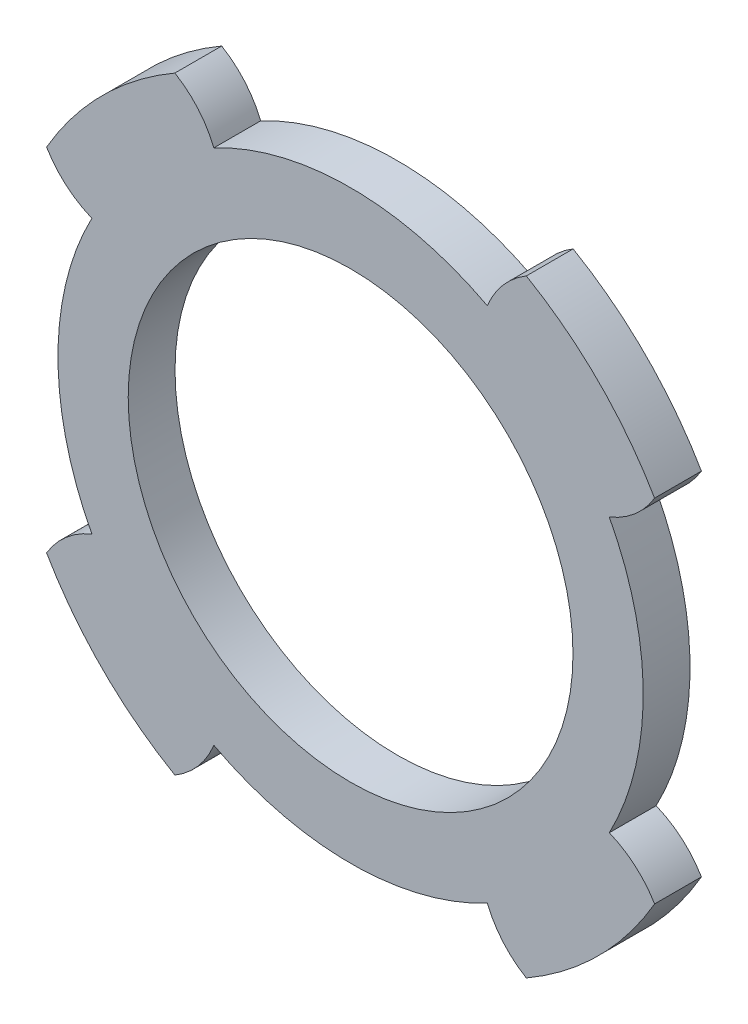
ISO-10303-21;
HEADER;
FILE_DESCRIPTION(('STEP AP214'),'2;1');
FILE_NAME('part.step','',(''),(''),'','','');
FILE_SCHEMA(('AUTOMOTIVE_DESIGN { 1 0 10303 214 1 1 1 1 }'));
ENDSEC;
DATA;
#1=APPLICATION_CONTEXT('core data for automotive mechanical design processes');
#2=APPLICATION_PROTOCOL_DEFINITION('international standard','automotive_design',2000,#1);
#3=PRODUCT_CONTEXT('',#1,'mechanical');
#4=PRODUCT('Part','Part','',(#3));
#5=PRODUCT_RELATED_PRODUCT_CATEGORY('part','',(#4));
#6=PRODUCT_DEFINITION_FORMATION('','',#4);
#7=PRODUCT_DEFINITION_CONTEXT('part definition',#1,'design');
#8=PRODUCT_DEFINITION('design','',#6,#7);
#9=PRODUCT_DEFINITION_SHAPE('','',#8);
#10=(LENGTH_UNIT() NAMED_UNIT(*) SI_UNIT(.MILLI.,.METRE.));
#11=(NAMED_UNIT(*) PLANE_ANGLE_UNIT() SI_UNIT($,.RADIAN.));
#12=(NAMED_UNIT(*) SI_UNIT($,.STERADIAN.) SOLID_ANGLE_UNIT());
#13=UNCERTAINTY_MEASURE_WITH_UNIT(LENGTH_MEASURE(1.E-05),#10,'distance_accuracy_value','');
#14=(GEOMETRIC_REPRESENTATION_CONTEXT(3) GLOBAL_UNCERTAINTY_ASSIGNED_CONTEXT((#13)) GLOBAL_UNIT_ASSIGNED_CONTEXT((#10,
#11,#12)) REPRESENTATION_CONTEXT('',''));
#15=CARTESIAN_POINT('',(0.,0.,0.));
#16=DIRECTION('',(0.,0.,1.));
#17=DIRECTION('',(1.,0.,0.));
#18=AXIS2_PLACEMENT_3D('',#15,#16,#17);
#19=CARTESIAN_POINT('',(9.54594154601839,9.54594154601839,4.));
#20=DIRECTION('',(0.,0.,1.));
#21=DIRECTION('',(1.,0.,0.));
#22=AXIS2_PLACEMENT_3D('',#19,#20,#21);
#23=CYLINDRICAL_SURFACE('',#22,4.);
#24=DIRECTION('',(0.,0.,-1.));
#25=VECTOR('',#24,1.);
#26=CARTESIAN_POINT('',(7.50620609596677,12.9867959884211,17.));
#27=LINE('',#26,#25);
#28=CARTESIAN_POINT('',(7.50620609596677,12.9867959884211,17.));
#29=VERTEX_POINT('',#28);
#30=CARTESIAN_POINT('',(7.50620609596677,12.9867959884211,15.));
#31=VERTEX_POINT('',#30);
#32=EDGE_CURVE('E224',#29,#31,#27,.T.);
#33=ORIENTED_EDGE('',*,*,#32,.T.);
#34=CARTESIAN_POINT('',(9.54594154601839,9.54594154601839,15.));
#35=DIRECTION('',(0.,0.,1.));
#36=DIRECTION('',(1.,0.,0.));
#37=AXIS2_PLACEMENT_3D('',#34,#35,#36);
#38=CIRCLE('',#37,4.);
#39=CARTESIAN_POINT('',(5.84021113093741,11.0517841974079,15.));
#40=VERTEX_POINT('',#39);
#41=EDGE_CURVE('E304',#31,#40,#38,.T.);
#42=ORIENTED_EDGE('',*,*,#41,.T.);
#43=DIRECTION('',(0.,0.,-1.));
#44=VECTOR('',#43,1.);
#45=CARTESIAN_POINT('',(5.84021113093741,11.0517841974079,17.));
#46=LINE('',#45,#44);
#47=CARTESIAN_POINT('',(5.84021113093741,11.0517841974079,17.));
#48=VERTEX_POINT('',#47);
#49=EDGE_CURVE('E218',#48,#40,#46,.T.);
#50=ORIENTED_EDGE('',*,*,#49,.F.);
#51=CARTESIAN_POINT('',(9.54594154601839,9.54594154601839,17.));
#52=DIRECTION('',(0.,0.,1.));
#53=DIRECTION('',(1.,0.,0.));
#54=AXIS2_PLACEMENT_3D('',#51,#52,#53);
#55=CIRCLE('',#54,4.);
#56=EDGE_CURVE('E226',#29,#48,#55,.T.);
#57=ORIENTED_EDGE('',*,*,#56,.F.);
#58=EDGE_LOOP('',(#33,#42,#50,#57));
#59=FACE_BOUND('',#58,.T.);
#60=ADVANCED_FACE('F90',(#59),#23,.T.);
#61=CARTESIAN_POINT('',(-9.54594154601839,9.54594154601839,17.));
#62=DIRECTION('',(0.,0.,-1.));
#63=DIRECTION('',(-1.,0.,0.));
#64=AXIS2_PLACEMENT_3D('',#61,#62,#63);
#65=CYLINDRICAL_SURFACE('',#64,4.);
#66=DIRECTION('',(0.,0.,-1.));
#67=VECTOR('',#66,1.);
#68=CARTESIAN_POINT('',(-5.84021113093741,11.0517841974079,17.));
#69=LINE('',#68,#67);
#70=CARTESIAN_POINT('',(-5.84021113093741,11.0517841974079,17.));
#71=VERTEX_POINT('',#70);
#72=CARTESIAN_POINT('',(-5.84021113093742,11.0517841974079,15.));
#73=VERTEX_POINT('',#72);
#74=EDGE_CURVE('E215',#71,#73,#69,.T.);
#75=ORIENTED_EDGE('',*,*,#74,.T.);
#76=CARTESIAN_POINT('',(-9.54594154601839,9.54594154601839,15.));
#77=DIRECTION('',(0.,0.,1.));
#78=DIRECTION('',(1.,0.,0.));
#79=AXIS2_PLACEMENT_3D('',#76,#77,#78);
#80=CIRCLE('',#79,4.);
#81=CARTESIAN_POINT('',(-7.50620609596677,12.9867959884211,15.));
#82=VERTEX_POINT('',#81);
#83=EDGE_CURVE('E199',#73,#82,#80,.T.);
#84=ORIENTED_EDGE('',*,*,#83,.T.);
#85=DIRECTION('',(0.,0.,-1.));
#86=VECTOR('',#85,1.);
#87=CARTESIAN_POINT('',(-7.50620609596677,12.9867959884211,17.));
#88=LINE('',#87,#86);
#89=CARTESIAN_POINT('',(-7.50620609596677,12.9867959884211,17.));
#90=VERTEX_POINT('',#89);
#91=EDGE_CURVE('E12',#90,#82,#88,.T.);
#92=ORIENTED_EDGE('',*,*,#91,.F.);
#93=CARTESIAN_POINT('',(-9.54594154601839,9.54594154601839,17.));
#94=DIRECTION('',(0.,0.,1.));
#95=DIRECTION('',(1.,0.,0.));
#96=AXIS2_PLACEMENT_3D('',#93,#94,#95);
#97=CIRCLE('',#96,4.);
#98=EDGE_CURVE('E219',#71,#90,#97,.T.);
#99=ORIENTED_EDGE('',*,*,#98,.F.);
#100=EDGE_LOOP('',(#75,#84,#92,#99));
#101=FACE_BOUND('',#100,.T.);
#102=ADVANCED_FACE('F222',(#101),#65,.T.);
#103=CARTESIAN_POINT('',(-9.54594154601839,-9.54594154601839,17.));
#104=DIRECTION('',(0.,0.,-1.));
#105=DIRECTION('',(-1.,0.,0.));
#106=AXIS2_PLACEMENT_3D('',#103,#104,#105);
#107=CYLINDRICAL_SURFACE('',#106,4.);
#108=DIRECTION('',(0.,0.,-1.));
#109=VECTOR('',#108,1.);
#110=CARTESIAN_POINT('',(-11.0517841974079,-5.84021113093741,17.));
#111=LINE('',#110,#109);
#112=CARTESIAN_POINT('',(-11.0517841974079,-5.84021113093741,17.));
#113=VERTEX_POINT('',#112);
#114=CARTESIAN_POINT('',(-11.0517841974079,-5.84021113093741,15.));
#115=VERTEX_POINT('',#114);
#116=EDGE_CURVE('E259',#113,#115,#111,.T.);
#117=ORIENTED_EDGE('',*,*,#116,.T.);
#118=CARTESIAN_POINT('',(-9.54594154601839,-9.54594154601839,15.));
#119=DIRECTION('',(0.,0.,1.));
#120=DIRECTION('',(1.,0.,0.));
#121=AXIS2_PLACEMENT_3D('',#118,#119,#120);
#122=CIRCLE('',#121,4.);
#123=CARTESIAN_POINT('',(-12.9867959884211,-7.50620609596677,15.));
#124=VERTEX_POINT('',#123);
#125=EDGE_CURVE('E337',#115,#124,#122,.T.);
#126=ORIENTED_EDGE('',*,*,#125,.T.);
#127=DIRECTION('',(0.,0.,-1.));
#128=VECTOR('',#127,1.);
#129=CARTESIAN_POINT('',(-12.9867959884211,-7.50620609596677,17.));
#130=LINE('',#129,#128);
#131=CARTESIAN_POINT('',(-12.9867959884211,-7.50620609596677,17.));
#132=VERTEX_POINT('',#131);
#133=EDGE_CURVE('E256',#132,#124,#130,.T.);
#134=ORIENTED_EDGE('',*,*,#133,.F.);
#135=CARTESIAN_POINT('',(-9.54594154601839,-9.54594154601839,17.));
#136=DIRECTION('',(0.,0.,1.));
#137=DIRECTION('',(1.,0.,0.));
#138=AXIS2_PLACEMENT_3D('',#135,#136,#137);
#139=CIRCLE('',#138,4.);
#140=EDGE_CURVE('E324',#113,#132,#139,.T.);
#141=ORIENTED_EDGE('',*,*,#140,.F.);
#142=EDGE_LOOP('',(#117,#126,#134,#141));
#143=FACE_BOUND('',#142,.T.);
#144=ADVANCED_FACE('F343',(#143),#107,.T.);
#145=CARTESIAN_POINT('',(9.54594154601839,-9.54594154601839,17.));
#146=DIRECTION('',(0.,0.,-1.));
#147=DIRECTION('',(-1.,0.,0.));
#148=AXIS2_PLACEMENT_3D('',#145,#146,#147);
#149=CYLINDRICAL_SURFACE('',#148,4.);
#150=DIRECTION('',(0.,0.,-1.));
#151=VECTOR('',#150,1.);
#152=CARTESIAN_POINT('',(12.9867959884211,-7.50620609596677,17.));
#153=LINE('',#152,#151);
#154=CARTESIAN_POINT('',(12.9867959884211,-7.50620609596677,17.));
#155=VERTEX_POINT('',#154);
#156=CARTESIAN_POINT('',(12.9867959884211,-7.50620609596677,15.));
#157=VERTEX_POINT('',#156);
#158=EDGE_CURVE('E241',#155,#157,#153,.T.);
#159=ORIENTED_EDGE('',*,*,#158,.T.);
#160=CARTESIAN_POINT('',(9.54594154601839,-9.54594154601839,15.));
#161=DIRECTION('',(0.,0.,1.));
#162=DIRECTION('',(1.,0.,0.));
#163=AXIS2_PLACEMENT_3D('',#160,#161,#162);
#164=CIRCLE('',#163,4.);
#165=CARTESIAN_POINT('',(11.0517841974079,-5.84021113093741,15.));
#166=VERTEX_POINT('',#165);
#167=EDGE_CURVE('E332',#157,#166,#164,.T.);
#168=ORIENTED_EDGE('',*,*,#167,.T.);
#169=DIRECTION('',(0.,0.,-1.));
#170=VECTOR('',#169,1.);
#171=CARTESIAN_POINT('',(11.0517841974079,-5.84021113093741,17.));
#172=LINE('',#171,#170);
#173=CARTESIAN_POINT('',(11.0517841974079,-5.84021113093741,17.));
#174=VERTEX_POINT('',#173);
#175=EDGE_CURVE('E238',#174,#166,#172,.T.);
#176=ORIENTED_EDGE('',*,*,#175,.F.);
#177=CARTESIAN_POINT('',(9.54594154601839,-9.54594154601839,17.));
#178=DIRECTION('',(0.,0.,1.));
#179=DIRECTION('',(1.,0.,0.));
#180=AXIS2_PLACEMENT_3D('',#177,#178,#179);
#181=CIRCLE('',#180,4.);
#182=EDGE_CURVE('E312',#155,#174,#181,.T.);
#183=ORIENTED_EDGE('',*,*,#182,.F.);
#184=EDGE_LOOP('',(#159,#168,#176,#183));
#185=FACE_BOUND('',#184,.T.);
#186=ADVANCED_FACE('F374',(#185),#149,.T.);
#187=DIRECTION('',(0.,0.,-1.));
#188=VECTOR('',#187,1.);
#189=CARTESIAN_POINT('',(11.0517841974079,5.84021113093741,17.));
#190=LINE('',#189,#188);
#191=CARTESIAN_POINT('',(11.0517841974079,5.84021113093741,17.));
#192=VERTEX_POINT('',#191);
#193=CARTESIAN_POINT('',(11.0517841974079,5.84021113093741,15.));
#194=VERTEX_POINT('',#193);
#195=EDGE_CURVE('E235',#192,#194,#190,.T.);
#196=ORIENTED_EDGE('',*,*,#195,.T.);
#197=CARTESIAN_POINT('',(12.9867959884211,7.50620609596677,15.));
#198=VERTEX_POINT('',#197);
#199=EDGE_CURVE('E336',#194,#198,#38,.T.);
#200=ORIENTED_EDGE('',*,*,#199,.T.);
#201=DIRECTION('',(0.,0.,-1.));
#202=VECTOR('',#201,1.);
#203=CARTESIAN_POINT('',(12.9867959884211,7.50620609596677,17.));
#204=LINE('',#203,#202);
#205=CARTESIAN_POINT('',(12.9867959884211,7.50620609596677,17.));
#206=VERTEX_POINT('',#205);
#207=EDGE_CURVE('E232',#206,#198,#204,.T.);
#208=ORIENTED_EDGE('',*,*,#207,.F.);
#209=CARTESIAN_POINT('',(9.54594154601839,9.54594154601839,17.));
#210=DIRECTION('',(0.,0.,1.));
#211=DIRECTION('',(1.,0.,0.));
#212=AXIS2_PLACEMENT_3D('',#209,#210,#211);
#213=CIRCLE('',#212,4.);
#214=EDGE_CURVE('E306',#192,#206,#213,.T.);
#215=ORIENTED_EDGE('',*,*,#214,.F.);
#216=EDGE_LOOP('',(#196,#200,#208,#215));
#217=FACE_BOUND('',#216,.T.);
#218=ADVANCED_FACE('F92',(#217),#23,.T.);
#219=CARTESIAN_POINT('',(-4.7729707730092,4.7729707730092,15.));
#220=DIRECTION('',(0.,0.,1.));
#221=DIRECTION('',(1.,0.,0.));
#222=AXIS2_PLACEMENT_3D('',#219,#220,#221);
#223=PLANE('',#222);
#224=CARTESIAN_POINT('',(0.,0.,15.));
#225=DIRECTION('',(0.,0.,1.));
#226=DIRECTION('',(1.,0.,0.));
#227=AXIS2_PLACEMENT_3D('',#224,#225,#226);
#228=CIRCLE('',#227,12.5);
#229=EDGE_CURVE('E204',#40,#73,#228,.T.);
#230=ORIENTED_EDGE('',*,*,#229,.F.);
#231=ORIENTED_EDGE('',*,*,#41,.F.);
#232=CARTESIAN_POINT('',(0.,0.,15.));
#233=DIRECTION('',(0.,0.,1.));
#234=DIRECTION('',(1.,0.,0.));
#235=AXIS2_PLACEMENT_3D('',#232,#233,#234);
#236=CIRCLE('',#235,15.);
#237=EDGE_CURVE('E220',#198,#31,#236,.T.);
#238=ORIENTED_EDGE('',*,*,#237,.F.);
#239=ORIENTED_EDGE('',*,*,#199,.F.);
#240=CARTESIAN_POINT('',(0.,0.,15.));
#241=DIRECTION('',(0.,0.,1.));
#242=DIRECTION('',(1.,0.,0.));
#243=AXIS2_PLACEMENT_3D('',#240,#241,#242);
#244=CIRCLE('',#243,12.5);
#245=EDGE_CURVE('E293',#166,#194,#244,.T.);
#246=ORIENTED_EDGE('',*,*,#245,.F.);
#247=ORIENTED_EDGE('',*,*,#167,.F.);
#248=CARTESIAN_POINT('',(0.,0.,15.));
#249=DIRECTION('',(0.,0.,1.));
#250=DIRECTION('',(1.,0.,0.));
#251=AXIS2_PLACEMENT_3D('',#248,#249,#250);
#252=CIRCLE('',#251,15.);
#253=CARTESIAN_POINT('',(7.50620609596677,-12.9867959884211,15.));
#254=VERTEX_POINT('',#253);
#255=EDGE_CURVE('E290',#254,#157,#252,.T.);
#256=ORIENTED_EDGE('',*,*,#255,.F.);
#257=CARTESIAN_POINT('',(5.84021113093741,-11.0517841974079,15.));
#258=VERTEX_POINT('',#257);
#259=EDGE_CURVE('E339',#258,#254,#164,.T.);
#260=ORIENTED_EDGE('',*,*,#259,.F.);
#261=CARTESIAN_POINT('',(0.,0.,15.));
#262=DIRECTION('',(0.,0.,1.));
#263=DIRECTION('',(1.,0.,0.));
#264=AXIS2_PLACEMENT_3D('',#261,#262,#263);
#265=CIRCLE('',#264,12.5);
#266=CARTESIAN_POINT('',(-5.84021113093741,-11.0517841974079,15.));
#267=VERTEX_POINT('',#266);
#268=EDGE_CURVE('E287',#267,#258,#265,.T.);
#269=ORIENTED_EDGE('',*,*,#268,.F.);
#270=CARTESIAN_POINT('',(-7.50620609596678,-12.9867959884211,15.));
#271=VERTEX_POINT('',#270);
#272=EDGE_CURVE('E334',#271,#267,#122,.T.);
#273=ORIENTED_EDGE('',*,*,#272,.F.);
#274=CARTESIAN_POINT('',(0.,0.,15.));
#275=DIRECTION('',(0.,0.,1.));
#276=DIRECTION('',(1.,0.,0.));
#277=AXIS2_PLACEMENT_3D('',#274,#275,#276);
#278=CIRCLE('',#277,15.);
#279=EDGE_CURVE('E278',#124,#271,#278,.T.);
#280=ORIENTED_EDGE('',*,*,#279,.F.);
#281=ORIENTED_EDGE('',*,*,#125,.F.);
#282=CARTESIAN_POINT('',(0.,0.,15.));
#283=DIRECTION('',(0.,0.,1.));
#284=DIRECTION('',(1.,0.,0.));
#285=AXIS2_PLACEMENT_3D('',#282,#283,#284);
#286=CIRCLE('',#285,12.5);
#287=CARTESIAN_POINT('',(-11.0517841974079,5.84021113093741,15.));
#288=VERTEX_POINT('',#287);
#289=EDGE_CURVE('E274',#288,#115,#286,.T.);
#290=ORIENTED_EDGE('',*,*,#289,.F.);
#291=CARTESIAN_POINT('',(-12.9867959884211,7.50620609596676,15.));
#292=VERTEX_POINT('',#291);
#293=EDGE_CURVE('E210',#292,#288,#80,.T.);
#294=ORIENTED_EDGE('',*,*,#293,.F.);
#295=CARTESIAN_POINT('',(0.,0.,15.));
#296=DIRECTION('',(0.,0.,1.));
#297=DIRECTION('',(1.,0.,0.));
#298=AXIS2_PLACEMENT_3D('',#295,#296,#297);
#299=CIRCLE('',#298,15.);
#300=EDGE_CURVE('E206',#82,#292,#299,.T.);
#301=ORIENTED_EDGE('',*,*,#300,.F.);
#302=ORIENTED_EDGE('',*,*,#83,.F.);
#303=EDGE_LOOP('',(#230,#231,#238,#239,#246,#247,#256,#260,#269,#273,#280,#281,#290,#294,#301,#302));
#304=FACE_BOUND('',#303,.T.);
#305=CARTESIAN_POINT('',(0.,0.,15.));
#306=DIRECTION('',(0.,0.,1.));
#307=DIRECTION('',(1.,0.,0.));
#308=AXIS2_PLACEMENT_3D('',#305,#306,#307);
#309=CIRCLE('',#308,9.5);
#310=CARTESIAN_POINT('',(9.5,0.,15.));
#311=VERTEX_POINT('',#310);
#312=EDGE_CURVE('E281',#311,#311,#309,.T.);
#313=ORIENTED_EDGE('',*,*,#312,.T.);
#314=EDGE_LOOP('',(#313));
#315=FACE_BOUND('',#314,.T.);
#316=ADVANCED_FACE('F201',(#304,#315),#223,.F.);
#317=CARTESIAN_POINT('',(-4.7729707730092,4.7729707730092,17.));
#318=DIRECTION('',(0.,0.,1.));
#319=DIRECTION('',(1.,0.,0.));
#320=AXIS2_PLACEMENT_3D('',#317,#318,#319);
#321=PLANE('',#320);
#322=ORIENTED_EDGE('',*,*,#98,.T.);
#323=CARTESIAN_POINT('',(0.,0.,17.));
#324=DIRECTION('',(0.,0.,1.));
#325=DIRECTION('',(1.,0.,0.));
#326=AXIS2_PLACEMENT_3D('',#323,#324,#325);
#327=CIRCLE('',#326,15.);
#328=CARTESIAN_POINT('',(-12.9867959884211,7.50620609596676,17.));
#329=VERTEX_POINT('',#328);
#330=EDGE_CURVE('E273',#90,#329,#327,.T.);
#331=ORIENTED_EDGE('',*,*,#330,.T.);
#332=CARTESIAN_POINT('',(-9.54594154601839,9.54594154601839,17.));
#333=DIRECTION('',(0.,0.,1.));
#334=DIRECTION('',(1.,0.,0.));
#335=AXIS2_PLACEMENT_3D('',#332,#333,#334);
#336=CIRCLE('',#335,4.);
#337=CARTESIAN_POINT('',(-11.0517841974079,5.84021113093741,17.));
#338=VERTEX_POINT('',#337);
#339=EDGE_CURVE('E270',#329,#338,#336,.T.);
#340=ORIENTED_EDGE('',*,*,#339,.T.);
#341=CARTESIAN_POINT('',(0.,0.,17.));
#342=DIRECTION('',(0.,0.,1.));
#343=DIRECTION('',(1.,0.,0.));
#344=AXIS2_PLACEMENT_3D('',#341,#342,#343);
#345=CIRCLE('',#344,12.5);
#346=EDGE_CURVE('E326',#338,#113,#345,.T.);
#347=ORIENTED_EDGE('',*,*,#346,.T.);
#348=ORIENTED_EDGE('',*,*,#140,.T.);
#349=CARTESIAN_POINT('',(0.,0.,17.));
#350=DIRECTION('',(0.,0.,1.));
#351=DIRECTION('',(1.,0.,0.));
#352=AXIS2_PLACEMENT_3D('',#349,#350,#351);
#353=CIRCLE('',#352,15.);
#354=CARTESIAN_POINT('',(-7.50620609596678,-12.9867959884211,17.));
#355=VERTEX_POINT('',#354);
#356=EDGE_CURVE('E322',#132,#355,#353,.T.);
#357=ORIENTED_EDGE('',*,*,#356,.T.);
#358=CARTESIAN_POINT('',(-9.54594154601839,-9.54594154601839,17.));
#359=DIRECTION('',(0.,0.,1.));
#360=DIRECTION('',(1.,0.,0.));
#361=AXIS2_PLACEMENT_3D('',#358,#359,#360);
#362=CIRCLE('',#361,4.);
#363=CARTESIAN_POINT('',(-5.84021113093741,-11.0517841974079,17.));
#364=VERTEX_POINT('',#363);
#365=EDGE_CURVE('E320',#355,#364,#362,.T.);
#366=ORIENTED_EDGE('',*,*,#365,.T.);
#367=CARTESIAN_POINT('',(0.,0.,17.));
#368=DIRECTION('',(0.,0.,1.));
#369=DIRECTION('',(1.,0.,0.));
#370=AXIS2_PLACEMENT_3D('',#367,#368,#369);
#371=CIRCLE('',#370,12.5);
#372=CARTESIAN_POINT('',(5.84021113093741,-11.0517841974079,17.));
#373=VERTEX_POINT('',#372);
#374=EDGE_CURVE('E318',#364,#373,#371,.T.);
#375=ORIENTED_EDGE('',*,*,#374,.T.);
#376=CARTESIAN_POINT('',(9.54594154601839,-9.54594154601839,17.));
#377=DIRECTION('',(0.,0.,1.));
#378=DIRECTION('',(1.,0.,0.));
#379=AXIS2_PLACEMENT_3D('',#376,#377,#378);
#380=CIRCLE('',#379,4.);
#381=CARTESIAN_POINT('',(7.50620609596677,-12.9867959884211,17.));
#382=VERTEX_POINT('',#381);
#383=EDGE_CURVE('E316',#373,#382,#380,.T.);
#384=ORIENTED_EDGE('',*,*,#383,.T.);
#385=CARTESIAN_POINT('',(0.,0.,17.));
#386=DIRECTION('',(0.,0.,1.));
#387=DIRECTION('',(1.,0.,0.));
#388=AXIS2_PLACEMENT_3D('',#385,#386,#387);
#389=CIRCLE('',#388,15.);
#390=EDGE_CURVE('E314',#382,#155,#389,.T.);
#391=ORIENTED_EDGE('',*,*,#390,.T.);
#392=ORIENTED_EDGE('',*,*,#182,.T.);
#393=CARTESIAN_POINT('',(0.,0.,17.));
#394=DIRECTION('',(0.,0.,1.));
#395=DIRECTION('',(1.,0.,0.));
#396=AXIS2_PLACEMENT_3D('',#393,#394,#395);
#397=CIRCLE('',#396,12.5);
#398=EDGE_CURVE('E310',#174,#192,#397,.T.);
#399=ORIENTED_EDGE('',*,*,#398,.T.);
#400=ORIENTED_EDGE('',*,*,#214,.T.);
#401=CARTESIAN_POINT('',(0.,0.,17.));
#402=DIRECTION('',(0.,0.,1.));
#403=DIRECTION('',(1.,0.,0.));
#404=AXIS2_PLACEMENT_3D('',#401,#402,#403);
#405=CIRCLE('',#404,15.);
#406=EDGE_CURVE('E305',#206,#29,#405,.T.);
#407=ORIENTED_EDGE('',*,*,#406,.T.);
#408=ORIENTED_EDGE('',*,*,#56,.T.);
#409=CARTESIAN_POINT('',(0.,0.,17.));
#410=DIRECTION('',(0.,0.,1.));
#411=DIRECTION('',(1.,0.,0.));
#412=AXIS2_PLACEMENT_3D('',#409,#410,#411);
#413=CIRCLE('',#412,12.5);
#414=EDGE_CURVE('E106',#48,#71,#413,.T.);
#415=ORIENTED_EDGE('',*,*,#414,.T.);
#416=EDGE_LOOP('',(#322,#331,#340,#347,#348,#357,#366,#375,#384,#391,#392,#399,#400,#407,#408,#415));
#417=FACE_BOUND('',#416,.T.);
#418=CARTESIAN_POINT('',(0.,0.,17.));
#419=DIRECTION('',(0.,0.,1.));
#420=DIRECTION('',(1.,0.,0.));
#421=AXIS2_PLACEMENT_3D('',#418,#419,#420);
#422=CIRCLE('',#421,9.5);
#423=CARTESIAN_POINT('',(9.5,0.,17.));
#424=VERTEX_POINT('',#423);
#425=EDGE_CURVE('E275',#424,#424,#422,.T.);
#426=ORIENTED_EDGE('',*,*,#425,.F.);
#427=EDGE_LOOP('',(#426));
#428=FACE_BOUND('',#427,.T.);
#429=ADVANCED_FACE('F352',(#417,#428),#321,.T.);
#430=DIRECTION('',(0.,0.,-1.));
#431=VECTOR('',#430,1.);
#432=CARTESIAN_POINT('',(-12.9867959884211,7.50620609596676,17.));
#433=LINE('',#432,#431);
#434=EDGE_CURVE('E99',#329,#292,#433,.T.);
#435=ORIENTED_EDGE('',*,*,#434,.T.);
#436=ORIENTED_EDGE('',*,*,#293,.T.);
#437=DIRECTION('',(0.,0.,-1.));
#438=VECTOR('',#437,1.);
#439=CARTESIAN_POINT('',(-11.0517841974079,5.84021113093741,17.));
#440=LINE('',#439,#438);
#441=EDGE_CURVE('E262',#338,#288,#440,.T.);
#442=ORIENTED_EDGE('',*,*,#441,.F.);
#443=ORIENTED_EDGE('',*,*,#339,.F.);
#444=EDGE_LOOP('',(#435,#436,#442,#443));
#445=FACE_BOUND('',#444,.T.);
#446=ADVANCED_FACE('F268',(#445),#65,.T.);
#447=CARTESIAN_POINT('',(0.,0.,17.));
#448=DIRECTION('',(0.,0.,-1.));
#449=DIRECTION('',(-1.,0.,0.));
#450=AXIS2_PLACEMENT_3D('',#447,#448,#449);
#451=CYLINDRICAL_SURFACE('',#450,15.);
#452=ORIENTED_EDGE('',*,*,#300,.T.);
#453=ORIENTED_EDGE('',*,*,#434,.F.);
#454=ORIENTED_EDGE('',*,*,#330,.F.);
#455=ORIENTED_EDGE('',*,*,#91,.T.);
#456=EDGE_LOOP('',(#452,#453,#454,#455));
#457=FACE_BOUND('',#456,.T.);
#458=ADVANCED_FACE('F272',(#457),#451,.T.);
#459=CARTESIAN_POINT('',(0.,0.,17.));
#460=DIRECTION('',(0.,0.,-1.));
#461=DIRECTION('',(-1.,0.,0.));
#462=AXIS2_PLACEMENT_3D('',#459,#460,#461);
#463=CYLINDRICAL_SURFACE('',#462,12.5);
#464=ORIENTED_EDGE('',*,*,#289,.T.);
#465=ORIENTED_EDGE('',*,*,#116,.F.);
#466=ORIENTED_EDGE('',*,*,#346,.F.);
#467=ORIENTED_EDGE('',*,*,#441,.T.);
#468=EDGE_LOOP('',(#464,#465,#466,#467));
#469=FACE_BOUND('',#468,.T.);
#470=ADVANCED_FACE('F357',(#469),#463,.T.);
#471=DIRECTION('',(0.,0.,-1.));
#472=VECTOR('',#471,1.);
#473=CARTESIAN_POINT('',(-7.50620609596678,-12.9867959884211,17.));
#474=LINE('',#473,#472);
#475=EDGE_CURVE('E253',#355,#271,#474,.T.);
#476=ORIENTED_EDGE('',*,*,#475,.T.);
#477=ORIENTED_EDGE('',*,*,#272,.T.);
#478=DIRECTION('',(0.,0.,-1.));
#479=VECTOR('',#478,1.);
#480=CARTESIAN_POINT('',(-5.84021113093741,-11.0517841974079,17.));
#481=LINE('',#480,#479);
#482=EDGE_CURVE('E250',#364,#267,#481,.T.);
#483=ORIENTED_EDGE('',*,*,#482,.F.);
#484=ORIENTED_EDGE('',*,*,#365,.F.);
#485=EDGE_LOOP('',(#476,#477,#483,#484));
#486=FACE_BOUND('',#485,.T.);
#487=ADVANCED_FACE('F359',(#486),#107,.T.);
#488=CARTESIAN_POINT('',(0.,0.,17.));
#489=DIRECTION('',(0.,0.,-1.));
#490=DIRECTION('',(-1.,0.,0.));
#491=AXIS2_PLACEMENT_3D('',#488,#489,#490);
#492=CYLINDRICAL_SURFACE('',#491,15.);
#493=ORIENTED_EDGE('',*,*,#279,.T.);
#494=ORIENTED_EDGE('',*,*,#475,.F.);
#495=ORIENTED_EDGE('',*,*,#356,.F.);
#496=ORIENTED_EDGE('',*,*,#133,.T.);
#497=EDGE_LOOP('',(#493,#494,#495,#496));
#498=FACE_BOUND('',#497,.T.);
#499=ADVANCED_FACE('F349',(#498),#492,.T.);
#500=CARTESIAN_POINT('',(0.,0.,17.));
#501=DIRECTION('',(0.,0.,-1.));
#502=DIRECTION('',(-1.,0.,0.));
#503=AXIS2_PLACEMENT_3D('',#500,#501,#502);
#504=CYLINDRICAL_SURFACE('',#503,12.5);
#505=ORIENTED_EDGE('',*,*,#268,.T.);
#506=DIRECTION('',(0.,0.,-1.));
#507=VECTOR('',#506,1.);
#508=CARTESIAN_POINT('',(5.84021113093741,-11.0517841974079,17.));
#509=LINE('',#508,#507);
#510=EDGE_CURVE('E247',#373,#258,#509,.T.);
#511=ORIENTED_EDGE('',*,*,#510,.F.);
#512=ORIENTED_EDGE('',*,*,#374,.F.);
#513=ORIENTED_EDGE('',*,*,#482,.T.);
#514=EDGE_LOOP('',(#505,#511,#512,#513));
#515=FACE_BOUND('',#514,.T.);
#516=ADVANCED_FACE('F404',(#515),#504,.T.);
#517=ORIENTED_EDGE('',*,*,#510,.T.);
#518=ORIENTED_EDGE('',*,*,#259,.T.);
#519=DIRECTION('',(0.,0.,-1.));
#520=VECTOR('',#519,1.);
#521=CARTESIAN_POINT('',(7.50620609596677,-12.9867959884211,17.));
#522=LINE('',#521,#520);
#523=EDGE_CURVE('E244',#382,#254,#522,.T.);
#524=ORIENTED_EDGE('',*,*,#523,.F.);
#525=ORIENTED_EDGE('',*,*,#383,.F.);
#526=EDGE_LOOP('',(#517,#518,#524,#525));
#527=FACE_BOUND('',#526,.T.);
#528=ADVANCED_FACE('F383',(#527),#149,.T.);
#529=CARTESIAN_POINT('',(0.,0.,17.));
#530=DIRECTION('',(0.,0.,-1.));
#531=DIRECTION('',(-1.,0.,0.));
#532=AXIS2_PLACEMENT_3D('',#529,#530,#531);
#533=CYLINDRICAL_SURFACE('',#532,15.);
#534=ORIENTED_EDGE('',*,*,#255,.T.);
#535=ORIENTED_EDGE('',*,*,#158,.F.);
#536=ORIENTED_EDGE('',*,*,#390,.F.);
#537=ORIENTED_EDGE('',*,*,#523,.T.);
#538=EDGE_LOOP('',(#534,#535,#536,#537));
#539=FACE_BOUND('',#538,.T.);
#540=ADVANCED_FACE('F394',(#539),#533,.T.);
#541=CARTESIAN_POINT('',(0.,0.,17.));
#542=DIRECTION('',(0.,0.,-1.));
#543=DIRECTION('',(-1.,0.,0.));
#544=AXIS2_PLACEMENT_3D('',#541,#542,#543);
#545=CYLINDRICAL_SURFACE('',#544,12.5);
#546=ORIENTED_EDGE('',*,*,#245,.T.);
#547=ORIENTED_EDGE('',*,*,#195,.F.);
#548=ORIENTED_EDGE('',*,*,#398,.F.);
#549=ORIENTED_EDGE('',*,*,#175,.T.);
#550=EDGE_LOOP('',(#546,#547,#548,#549));
#551=FACE_BOUND('',#550,.T.);
#552=ADVANCED_FACE('F388',(#551),#545,.T.);
#553=CARTESIAN_POINT('',(0.,0.,17.));
#554=DIRECTION('',(0.,0.,-1.));
#555=DIRECTION('',(-1.,0.,0.));
#556=AXIS2_PLACEMENT_3D('',#553,#554,#555);
#557=CYLINDRICAL_SURFACE('',#556,15.);
#558=ORIENTED_EDGE('',*,*,#237,.T.);
#559=ORIENTED_EDGE('',*,*,#32,.F.);
#560=ORIENTED_EDGE('',*,*,#406,.F.);
#561=ORIENTED_EDGE('',*,*,#207,.T.);
#562=EDGE_LOOP('',(#558,#559,#560,#561));
#563=FACE_BOUND('',#562,.T.);
#564=ADVANCED_FACE('F298',(#563),#557,.T.);
#565=CARTESIAN_POINT('',(0.,0.,17.));
#566=DIRECTION('',(0.,0.,-1.));
#567=DIRECTION('',(-1.,0.,0.));
#568=AXIS2_PLACEMENT_3D('',#565,#566,#567);
#569=CYLINDRICAL_SURFACE('',#568,12.5);
#570=ORIENTED_EDGE('',*,*,#229,.T.);
#571=ORIENTED_EDGE('',*,*,#74,.F.);
#572=ORIENTED_EDGE('',*,*,#414,.F.);
#573=ORIENTED_EDGE('',*,*,#49,.T.);
#574=EDGE_LOOP('',(#570,#571,#572,#573));
#575=FACE_BOUND('',#574,.T.);
#576=ADVANCED_FACE('F214',(#575),#569,.T.);
#577=CARTESIAN_POINT('',(0.,0.,17.));
#578=DIRECTION('',(0.,0.,-1.));
#579=DIRECTION('',(-1.,0.,0.));
#580=AXIS2_PLACEMENT_3D('',#577,#578,#579);
#581=CYLINDRICAL_SURFACE('',#580,9.5);
#582=ORIENTED_EDGE('',*,*,#425,.T.);
#583=EDGE_LOOP('',(#582));
#584=FACE_BOUND('',#583,.T.);
#585=ORIENTED_EDGE('',*,*,#312,.F.);
#586=EDGE_LOOP('',(#585));
#587=FACE_BOUND('',#586,.T.);
#588=ADVANCED_FACE('F420',(#584,#587),#581,.F.);
#589=CLOSED_SHELL('',(#60,#102,#144,#186,#218,#316,#429,#446,#458,#470,#487,#499,#516,#528,#540,
#552,#564,#576,#588));
#590=MANIFOLD_SOLID_BREP('B2',#589);
#591=ADVANCED_BREP_SHAPE_REPRESENTATION('',(#18,#590),#14);
#592=SHAPE_DEFINITION_REPRESENTATION(#9,#591);
ENDSEC;
END-ISO-10303-21;
